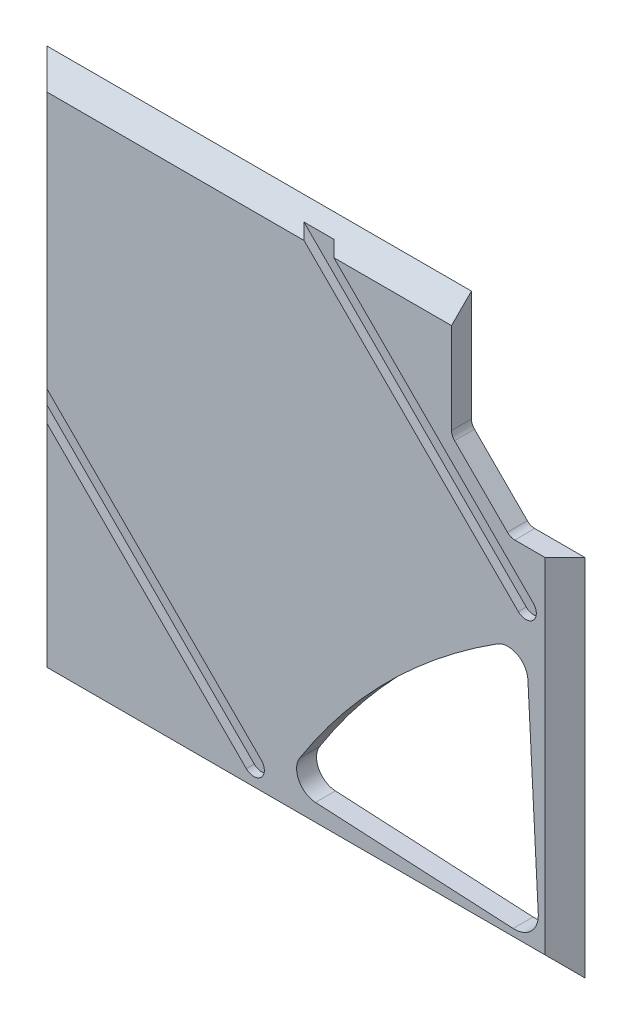
ISO-10303-21;
HEADER;
FILE_DESCRIPTION(('STEP AP214'),'2;1');
FILE_NAME('part.step','',(''),(''),'','','');
FILE_SCHEMA(('AUTOMOTIVE_DESIGN { 1 0 10303 214 1 1 1 1 }'));
ENDSEC;
DATA;
#1=APPLICATION_CONTEXT('core data for automotive mechanical design processes');
#2=APPLICATION_PROTOCOL_DEFINITION('international standard','automotive_design',2000,#1);
#3=PRODUCT_CONTEXT('',#1,'mechanical');
#4=PRODUCT('Part','Part','',(#3));
#5=PRODUCT_RELATED_PRODUCT_CATEGORY('part','',(#4));
#6=PRODUCT_DEFINITION_FORMATION('','',#4);
#7=PRODUCT_DEFINITION_CONTEXT('part definition',#1,'design');
#8=PRODUCT_DEFINITION('design','',#6,#7);
#9=PRODUCT_DEFINITION_SHAPE('','',#8);
#10=(LENGTH_UNIT() NAMED_UNIT(*) SI_UNIT(.MILLI.,.METRE.));
#11=(NAMED_UNIT(*) PLANE_ANGLE_UNIT() SI_UNIT($,.RADIAN.));
#12=(NAMED_UNIT(*) SI_UNIT($,.STERADIAN.) SOLID_ANGLE_UNIT());
#13=UNCERTAINTY_MEASURE_WITH_UNIT(LENGTH_MEASURE(1.E-05),#10,'distance_accuracy_value','');
#14=(GEOMETRIC_REPRESENTATION_CONTEXT(3) GLOBAL_UNCERTAINTY_ASSIGNED_CONTEXT((#13)) GLOBAL_UNIT_ASSIGNED_CONTEXT((#10,
#11,#12)) REPRESENTATION_CONTEXT('',''));
#15=CARTESIAN_POINT('',(0.,0.,0.));
#16=DIRECTION('',(0.,0.,1.));
#17=DIRECTION('',(1.,0.,0.));
#18=AXIS2_PLACEMENT_3D('',#15,#16,#17);
#19=CARTESIAN_POINT('',(-171.45,171.45,0.));
#20=DIRECTION('',(-0.707106781186546,0.,0.707106781186549));
#21=DIRECTION('',(0.707106781186549,0.,0.707106781186546));
#22=AXIS2_PLACEMENT_3D('',#19,#20,#21);
#23=PLANE('',#22);
#24=DIRECTION('',(0.,-1.,0.));
#25=VECTOR('',#24,1.);
#26=CARTESIAN_POINT('',(-163.83,171.45,7.62));
#27=LINE('',#26,#25);
#28=CARTESIAN_POINT('',(-163.83,-19.0080146249695,7.62));
#29=VERTEX_POINT('',#28);
#30=CARTESIAN_POINT('',(-163.83,0.0301283516971028,7.62));
#31=VERTEX_POINT('',#30);
#32=EDGE_CURVE('E11',#29,#31,#27,.F.);
#33=ORIENTED_EDGE('',*,*,#32,.T.);
#34=DIRECTION('',(-0.577350269189627,0.577350269189626,-0.577350269189624));
#35=VECTOR('',#34,1.);
#36=CARTESIAN_POINT('',(-226.049957216101,62.2500855677982,-54.5999572161009));
#37=LINE('',#36,#35);
#38=CARTESIAN_POINT('',(-158.75,-5.04987164830288,12.7));
#39=VERTEX_POINT('',#38);
#40=EDGE_CURVE('E335',#31,#39,#37,.F.);
#41=ORIENTED_EDGE('',*,*,#40,.T.);
#42=DIRECTION('',(0.,1.,0.));
#43=VECTOR('',#42,1.);
#44=CARTESIAN_POINT('',(-158.75,171.45,12.7));
#45=LINE('',#44,#43);
#46=CARTESIAN_POINT('',(-158.75,158.75,12.7));
#47=VERTEX_POINT('',#46);
#48=EDGE_CURVE('E360',#47,#39,#45,.F.);
#49=ORIENTED_EDGE('',*,*,#48,.F.);
#50=DIRECTION('',(-0.577350269189627,0.577350269189627,-0.577350269189624));
#51=VECTOR('',#50,1.);
#52=CARTESIAN_POINT('',(-171.45,171.45,0.));
#53=LINE('',#52,#51);
#54=CARTESIAN_POINT('',(-171.45,171.45,0.));
#55=VERTEX_POINT('',#54);
#56=EDGE_CURVE('E354',#47,#55,#53,.T.);
#57=ORIENTED_EDGE('',*,*,#56,.T.);
#58=DIRECTION('',(0.,-1.,0.));
#59=VECTOR('',#58,1.);
#60=CARTESIAN_POINT('',(-171.45,171.45,0.));
#61=LINE('',#60,#59);
#62=CARTESIAN_POINT('',(-171.45,-171.45,0.));
#63=VERTEX_POINT('',#62);
#64=EDGE_CURVE('E338',#55,#63,#61,.T.);
#65=ORIENTED_EDGE('',*,*,#64,.T.);
#66=DIRECTION('',(-0.577350269189626,-0.577350269189627,-0.577350269189624));
#67=VECTOR('',#66,1.);
#68=CARTESIAN_POINT('',(-171.45,-171.45,0.));
#69=LINE('',#68,#67);
#70=CARTESIAN_POINT('',(-158.75,-158.75,12.7));
#71=VERTEX_POINT('',#70);
#72=EDGE_CURVE('E349',#71,#63,#69,.T.);
#73=ORIENTED_EDGE('',*,*,#72,.F.);
#74=CARTESIAN_POINT('',(-158.75,-24.0880146249695,12.7));
#75=VERTEX_POINT('',#74);
#76=EDGE_CURVE('E348',#75,#71,#45,.F.);
#77=ORIENTED_EDGE('',*,*,#76,.F.);
#78=DIRECTION('',(0.577350269189627,-0.577350269189626,0.577350269189624));
#79=VECTOR('',#78,1.);
#80=CARTESIAN_POINT('',(-232.39600487499,49.5579902500205,-60.9460048749898));
#81=LINE('',#80,#79);
#82=EDGE_CURVE('E332',#75,#29,#81,.F.);
#83=ORIENTED_EDGE('',*,*,#82,.T.);
#84=EDGE_LOOP('',(#33,#41,#49,#57,#65,#73,#77,#83));
#85=FACE_BOUND('',#84,.T.);
#86=ADVANCED_FACE('F39',(#85),#23,.T.);
#87=CARTESIAN_POINT('',(-171.45,-171.45,0.));
#88=DIRECTION('',(0.,-0.707106781186546,0.707106781186549));
#89=DIRECTION('',(0.,-0.707106781186549,-0.707106781186546));
#90=AXIS2_PLACEMENT_3D('',#87,#88,#89);
#91=PLANE('',#90);
#92=DIRECTION('',(1.,0.,0.));
#93=VECTOR('',#92,1.);
#94=CARTESIAN_POINT('',(-171.45,-171.45,0.));
#95=LINE('',#94,#93);
#96=CARTESIAN_POINT('',(171.45,-171.45,0.));
#97=VERTEX_POINT('',#96);
#98=EDGE_CURVE('E341',#63,#97,#95,.T.);
#99=ORIENTED_EDGE('',*,*,#98,.T.);
#100=DIRECTION('',(0.577350269189627,-0.577350269189627,-0.577350269189624));
#101=VECTOR('',#100,1.);
#102=CARTESIAN_POINT('',(57.1499999999994,-57.1499999999997,114.3));
#103=LINE('',#102,#101);
#104=CARTESIAN_POINT('',(158.75,-158.75,12.7));
#105=VERTEX_POINT('',#104);
#106=EDGE_CURVE('E353',#105,#97,#103,.T.);
#107=ORIENTED_EDGE('',*,*,#106,.F.);
#108=DIRECTION('',(-1.,0.,0.));
#109=VECTOR('',#108,1.);
#110=CARTESIAN_POINT('',(-171.45,-158.75,12.7));
#111=LINE('',#110,#109);
#112=EDGE_CURVE('E363',#71,#105,#111,.F.);
#113=ORIENTED_EDGE('',*,*,#112,.F.);
#114=ORIENTED_EDGE('',*,*,#72,.T.);
#115=EDGE_LOOP('',(#99,#107,#113,#114));
#116=FACE_BOUND('',#115,.T.);
#117=ADVANCED_FACE('F426',(#116),#91,.T.);
#118=CARTESIAN_POINT('',(171.45,171.45,0.));
#119=DIRECTION('',(0.707106781186546,0.,0.707106781186549));
#120=DIRECTION('',(0.707106781186549,0.,-0.707106781186546));
#121=AXIS2_PLACEMENT_3D('',#118,#119,#120);
#122=PLANE('',#121);
#123=DIRECTION('',(0.,1.,0.));
#124=VECTOR('',#123,1.);
#125=CARTESIAN_POINT('',(171.45,171.45,0.));
#126=LINE('',#125,#124);
#127=CARTESIAN_POINT('',(171.45,60.579,0.));
#128=VERTEX_POINT('',#127);
#129=EDGE_CURVE('E343',#97,#128,#126,.T.);
#130=ORIENTED_EDGE('',*,*,#129,.T.);
#131=DIRECTION('',(0.707106781186549,0.,-0.707106781186546));
#132=VECTOR('',#131,1.);
#133=CARTESIAN_POINT('',(171.45,60.579,0.));
#134=LINE('',#133,#132);
#135=CARTESIAN_POINT('',(158.75,60.579,12.7));
#136=VERTEX_POINT('',#135);
#137=EDGE_CURVE('E286',#128,#136,#134,.F.);
#138=ORIENTED_EDGE('',*,*,#137,.T.);
#139=DIRECTION('',(0.,-1.,0.));
#140=VECTOR('',#139,1.);
#141=CARTESIAN_POINT('',(158.75,171.45,12.7));
#142=LINE('',#141,#140);
#143=EDGE_CURVE('E365',#105,#136,#142,.F.);
#144=ORIENTED_EDGE('',*,*,#143,.F.);
#145=ORIENTED_EDGE('',*,*,#106,.T.);
#146=EDGE_LOOP('',(#130,#138,#144,#145));
#147=FACE_BOUND('',#146,.T.);
#148=ADVANCED_FACE('F431',(#147),#122,.T.);
#149=CARTESIAN_POINT('',(-171.45,171.45,0.));
#150=DIRECTION('',(0.,0.707106781186546,0.707106781186549));
#151=DIRECTION('',(0.,-0.707106781186549,0.707106781186546));
#152=AXIS2_PLACEMENT_3D('',#149,#150,#151);
#153=PLANE('',#152);
#154=DIRECTION('',(1.,0.,0.));
#155=VECTOR('',#154,1.);
#156=CARTESIAN_POINT('',(-171.45,158.75,12.7));
#157=LINE('',#156,#155);
#158=CARTESIAN_POINT('',(99.0600000000005,158.75,12.7));
#159=VERTEX_POINT('',#158);
#160=CARTESIAN_POINT('',(24.0880146249694,158.75,12.7));
#161=VERTEX_POINT('',#160);
#162=EDGE_CURVE('E357',#159,#161,#157,.F.);
#163=ORIENTED_EDGE('',*,*,#162,.F.);
#164=DIRECTION('',(0.,-0.707106781186549,0.707106781186546));
#165=VECTOR('',#164,1.);
#166=CARTESIAN_POINT('',(99.0600000000005,171.45,0.));
#167=LINE('',#166,#165);
#168=CARTESIAN_POINT('',(99.0600000000005,171.45,0.));
#169=VERTEX_POINT('',#168);
#170=EDGE_CURVE('E277',#159,#169,#167,.F.);
#171=ORIENTED_EDGE('',*,*,#170,.T.);
#172=DIRECTION('',(-1.,0.,0.));
#173=VECTOR('',#172,1.);
#174=CARTESIAN_POINT('',(-171.45,171.45,0.));
#175=LINE('',#174,#173);
#176=EDGE_CURVE('E346',#169,#55,#175,.T.);
#177=ORIENTED_EDGE('',*,*,#176,.T.);
#178=ORIENTED_EDGE('',*,*,#56,.F.);
#179=CARTESIAN_POINT('',(5.04987164830285,158.75,12.7));
#180=VERTEX_POINT('',#179);
#181=EDGE_CURVE('E368',#180,#47,#157,.F.);
#182=ORIENTED_EDGE('',*,*,#181,.F.);
#183=DIRECTION('',(0.577350269189628,-0.577350269189626,0.577350269189624));
#184=VECTOR('',#183,1.);
#185=CARTESIAN_POINT('',(-62.2500855677983,226.049957216101,-54.5999572161008));
#186=LINE('',#185,#184);
#187=CARTESIAN_POINT('',(-0.0301283516971956,163.83,7.62));
#188=VERTEX_POINT('',#187);
#189=EDGE_CURVE('E329',#180,#188,#186,.F.);
#190=ORIENTED_EDGE('',*,*,#189,.T.);
#191=DIRECTION('',(1.,0.,0.));
#192=VECTOR('',#191,1.);
#193=CARTESIAN_POINT('',(-171.45,163.83,7.62));
#194=LINE('',#193,#192);
#195=CARTESIAN_POINT('',(19.0080146249695,163.83,7.62));
#196=VERTEX_POINT('',#195);
#197=EDGE_CURVE('E47',#196,#188,#194,.F.);
#198=ORIENTED_EDGE('',*,*,#197,.F.);
#199=DIRECTION('',(-0.577350269189628,0.577350269189626,-0.577350269189624));
#200=VECTOR('',#199,1.);
#201=CARTESIAN_POINT('',(-49.5579902500207,232.39600487499,-60.9460048749897));
#202=LINE('',#201,#200);
#203=EDGE_CURVE('E307',#196,#161,#202,.F.);
#204=ORIENTED_EDGE('',*,*,#203,.T.);
#205=EDGE_LOOP('',(#163,#171,#177,#178,#182,#190,#198,#204));
#206=FACE_BOUND('',#205,.T.);
#207=ADVANCED_FACE('F41',(#206),#153,.T.);
#208=CARTESIAN_POINT('',(0.,0.,12.7));
#209=DIRECTION('',(0.,0.,1.));
#210=DIRECTION('',(1.,0.,0.));
#211=AXIS2_PLACEMENT_3D('',#208,#209,#210);
#212=PLANE('',#211);
#213=CARTESIAN_POINT('',(345.666968748742,-345.666968748741,12.7));
#214=DIRECTION('',(0.,0.,-1.));
#215=DIRECTION('',(1.,0.,0.));
#216=AXIS2_PLACEMENT_3D('',#213,#214,#215);
#217=CIRCLE('',#216,406.4);
#218=CARTESIAN_POINT('',(2.3064887303102,-128.262873199664,12.7));
#219=VERTEX_POINT('',#218);
#220=CARTESIAN_POINT('',(128.262873199664,-2.30648873031014,12.7));
#221=VERTEX_POINT('',#220);
#222=EDGE_CURVE('E196',#219,#221,#217,.T.);
#223=ORIENTED_EDGE('',*,*,#222,.T.);
#224=CARTESIAN_POINT('',(135.056751185572,-13.0365037308861,12.7));
#225=DIRECTION('',(0.,0.,-1.));
#226=DIRECTION('',(1.,0.,0.));
#227=AXIS2_PLACEMENT_3D('',#224,#225,#226);
#228=CIRCLE('',#227,12.7);
#229=CARTESIAN_POINT('',(147.739346276955,-12.3718370866007,12.7));
#230=VERTEX_POINT('',#229);
#231=EDGE_CURVE('E205',#221,#230,#228,.T.);
#232=ORIENTED_EDGE('',*,*,#231,.T.);
#233=DIRECTION('',(0.0523359562429441,-0.998629534754574,0.));
#234=VECTOR('',#233,1.);
#235=CARTESIAN_POINT('',(154.34019207381,-138.323477991009,12.7));
#236=LINE('',#235,#234);
#237=CARTESIAN_POINT('',(154.34019207381,-138.323477991009,12.7));
#238=VERTEX_POINT('',#237);
#239=EDGE_CURVE('E54',#230,#238,#236,.T.);
#240=ORIENTED_EDGE('',*,*,#239,.T.);
#241=CARTESIAN_POINT('',(139.121077964151,-139.121077964151,12.7));
#242=DIRECTION('',(0.,0.,-1.));
#243=DIRECTION('',(-1.,0.,0.));
#244=AXIS2_PLACEMENT_3D('',#241,#242,#243);
#245=CIRCLE('',#244,15.24);
#246=CARTESIAN_POINT('',(138.323477991008,-154.340192073811,12.7));
#247=VERTEX_POINT('',#246);
#248=EDGE_CURVE('E220',#238,#247,#245,.T.);
#249=ORIENTED_EDGE('',*,*,#248,.T.);
#250=DIRECTION('',(-0.998629534754574,0.0523359562429438,0.));
#251=VECTOR('',#250,1.);
#252=CARTESIAN_POINT('',(12.3718370866009,-147.739346276956,12.7));
#253=LINE('',#252,#251);
#254=CARTESIAN_POINT('',(12.3718370866009,-147.739346276956,12.7));
#255=VERTEX_POINT('',#254);
#256=EDGE_CURVE('E223',#247,#255,#253,.T.);
#257=ORIENTED_EDGE('',*,*,#256,.T.);
#258=CARTESIAN_POINT('',(13.0365037308862,-135.056751185573,12.7));
#259=DIRECTION('',(0.,0.,-1.));
#260=DIRECTION('',(1.,0.,0.));
#261=AXIS2_PLACEMENT_3D('',#258,#259,#260);
#262=CIRCLE('',#261,12.7);
#263=EDGE_CURVE('E202',#255,#219,#262,.T.);
#264=ORIENTED_EDGE('',*,*,#263,.T.);
#265=EDGE_LOOP('',(#223,#232,#240,#249,#257,#264));
#266=FACE_BOUND('',#265,.T.);
#267=DIRECTION('',(1.,0.,0.));
#268=VECTOR('',#267,1.);
#269=CARTESIAN_POINT('',(139.362890784593,60.579,12.7));
#270=LINE('',#269,#268);
#271=CARTESIAN_POINT('',(139.362890784593,60.579,12.7));
#272=VERTEX_POINT('',#271);
#273=EDGE_CURVE('E251',#272,#136,#270,.T.);
#274=ORIENTED_EDGE('',*,*,#273,.F.);
#275=CARTESIAN_POINT('',(139.362890784593,67.183,12.7));
#276=DIRECTION('',(0.,0.,1.));
#277=DIRECTION('',(1.,0.,0.));
#278=AXIS2_PLACEMENT_3D('',#275,#276,#277);
#279=CIRCLE('',#278,6.60400000000001);
#280=CARTESIAN_POINT('',(134.693157601637,62.513266817044,12.7));
#281=VERTEX_POINT('',#280);
#282=EDGE_CURVE('E271',#281,#272,#279,.T.);
#283=ORIENTED_EDGE('',*,*,#282,.F.);
#284=DIRECTION('',(0.707106781186548,-0.707106781186548,0.));
#285=VECTOR('',#284,1.);
#286=CARTESIAN_POINT('',(100.994266817045,96.2121576016369,12.7));
#287=LINE('',#286,#285);
#288=CARTESIAN_POINT('',(100.994266817045,96.2121576016369,12.7));
#289=VERTEX_POINT('',#288);
#290=EDGE_CURVE('E268',#289,#281,#287,.T.);
#291=ORIENTED_EDGE('',*,*,#290,.F.);
#292=CARTESIAN_POINT('',(105.664,100.881890784593,12.7));
#293=DIRECTION('',(0.,0.,1.));
#294=DIRECTION('',(1.,0.,0.));
#295=AXIS2_PLACEMENT_3D('',#292,#293,#294);
#296=CIRCLE('',#295,6.60400000000001);
#297=CARTESIAN_POINT('',(99.0600000000005,100.881890784593,12.7));
#298=VERTEX_POINT('',#297);
#299=EDGE_CURVE('E265',#298,#289,#296,.T.);
#300=ORIENTED_EDGE('',*,*,#299,.F.);
#301=DIRECTION('',(0.,-1.,0.));
#302=VECTOR('',#301,1.);
#303=CARTESIAN_POINT('',(99.0600000000005,171.45,12.7));
#304=LINE('',#303,#302);
#305=EDGE_CURVE('E239',#159,#298,#304,.T.);
#306=ORIENTED_EDGE('',*,*,#305,.F.);
#307=ORIENTED_EDGE('',*,*,#162,.T.);
#308=DIRECTION('',(-0.707106781186549,0.707106781186546,0.));
#309=VECTOR('',#308,1.);
#310=CARTESIAN_POINT('',(151.13,31.7080146249701,12.7));
#311=LINE('',#310,#309);
#312=CARTESIAN_POINT('',(151.13,31.7080146249701,12.7));
#313=VERTEX_POINT('',#312);
#314=EDGE_CURVE('E316',#313,#161,#311,.T.);
#315=ORIENTED_EDGE('',*,*,#314,.F.);
#316=CARTESIAN_POINT('',(146.370464255833,26.9484788808035,12.7));
#317=DIRECTION('',(0.,0.,1.));
#318=DIRECTION('',(1.,0.,0.));
#319=AXIS2_PLACEMENT_3D('',#316,#317,#318);
#320=CIRCLE('',#319,6.73100000000002);
#321=CARTESIAN_POINT('',(141.610928511666,22.1889431366368,12.7));
#322=VERTEX_POINT('',#321);
#323=EDGE_CURVE('E303',#322,#313,#320,.T.);
#324=ORIENTED_EDGE('',*,*,#323,.F.);
#325=DIRECTION('',(0.707106781186549,-0.707106781186547,0.));
#326=VECTOR('',#325,1.);
#327=CARTESIAN_POINT('',(81.8999358241514,81.8999358241516,12.7));
#328=LINE('',#327,#326);
#329=EDGE_CURVE('E352',#180,#322,#328,.T.);
#330=ORIENTED_EDGE('',*,*,#329,.F.);
#331=ORIENTED_EDGE('',*,*,#181,.T.);
#332=ORIENTED_EDGE('',*,*,#48,.T.);
#333=DIRECTION('',(-0.707106781186548,0.707106781186547,0.));
#334=VECTOR('',#333,1.);
#335=CARTESIAN_POINT('',(-171.45,7.65012835169715,12.7));
#336=LINE('',#335,#334);
#337=CARTESIAN_POINT('',(-22.1889431366358,-141.610928511667,12.7));
#338=VERTEX_POINT('',#337);
#339=EDGE_CURVE('E293',#338,#39,#336,.T.);
#340=ORIENTED_EDGE('',*,*,#339,.F.);
#341=CARTESIAN_POINT('',(-26.9484788808025,-146.370464255833,12.7));
#342=DIRECTION('',(0.,0.,1.));
#343=DIRECTION('',(-1.,0.,0.));
#344=AXIS2_PLACEMENT_3D('',#341,#342,#343);
#345=CIRCLE('',#344,6.73100000000005);
#346=CARTESIAN_POINT('',(-31.7080146249692,-151.13,12.7));
#347=VERTEX_POINT('',#346);
#348=EDGE_CURVE('E300',#347,#338,#345,.T.);
#349=ORIENTED_EDGE('',*,*,#348,.F.);
#350=DIRECTION('',(0.707106781186548,-0.707106781186547,0.));
#351=VECTOR('',#350,1.);
#352=CARTESIAN_POINT('',(-91.4190073124846,-91.4190073124846,12.7));
#353=LINE('',#352,#351);
#354=EDGE_CURVE('E371',#75,#347,#353,.T.);
#355=ORIENTED_EDGE('',*,*,#354,.F.);
#356=ORIENTED_EDGE('',*,*,#76,.T.);
#357=ORIENTED_EDGE('',*,*,#112,.T.);
#358=ORIENTED_EDGE('',*,*,#143,.T.);
#359=EDGE_LOOP('',(#274,#283,#291,#300,#306,#307,#315,#324,#330,#331,#332,#340,#349,#355,#356,
#357,#358));
#360=FACE_BOUND('',#359,.T.);
#361=ADVANCED_FACE('F209',(#266,#360),#212,.T.);
#362=CARTESIAN_POINT('',(0.,0.,0.));
#363=DIRECTION('',(0.,0.,1.));
#364=DIRECTION('',(1.,0.,0.));
#365=AXIS2_PLACEMENT_3D('',#362,#363,#364);
#366=PLANE('',#365);
#367=CARTESIAN_POINT('',(135.056751185572,-13.0365037308861,0.));
#368=DIRECTION('',(0.,0.,-1.));
#369=DIRECTION('',(1.,0.,0.));
#370=AXIS2_PLACEMENT_3D('',#367,#368,#369);
#371=CIRCLE('',#370,12.7);
#372=CARTESIAN_POINT('',(128.262873199664,-2.30648873031014,0.));
#373=VERTEX_POINT('',#372);
#374=CARTESIAN_POINT('',(147.739346276955,-12.3718370866007,0.));
#375=VERTEX_POINT('',#374);
#376=EDGE_CURVE('E227',#373,#375,#371,.T.);
#377=ORIENTED_EDGE('',*,*,#376,.F.);
#378=CARTESIAN_POINT('',(345.666968748742,-345.666968748741,0.));
#379=DIRECTION('',(0.,0.,-1.));
#380=DIRECTION('',(1.,0.,0.));
#381=AXIS2_PLACEMENT_3D('',#378,#379,#380);
#382=CIRCLE('',#381,406.4);
#383=CARTESIAN_POINT('',(2.3064887303102,-128.262873199664,0.));
#384=VERTEX_POINT('',#383);
#385=EDGE_CURVE('E62',#384,#373,#382,.T.);
#386=ORIENTED_EDGE('',*,*,#385,.F.);
#387=CARTESIAN_POINT('',(13.0365037308862,-135.056751185573,0.));
#388=DIRECTION('',(0.,0.,-1.));
#389=DIRECTION('',(1.,0.,0.));
#390=AXIS2_PLACEMENT_3D('',#387,#388,#389);
#391=CIRCLE('',#390,12.7);
#392=CARTESIAN_POINT('',(12.3718370866009,-147.739346276956,0.));
#393=VERTEX_POINT('',#392);
#394=EDGE_CURVE('E213',#393,#384,#391,.T.);
#395=ORIENTED_EDGE('',*,*,#394,.F.);
#396=DIRECTION('',(-0.998629534754574,0.0523359562429438,0.));
#397=VECTOR('',#396,1.);
#398=CARTESIAN_POINT('',(12.3718370866009,-147.739346276956,0.));
#399=LINE('',#398,#397);
#400=CARTESIAN_POINT('',(138.323477991008,-154.340192073811,0.));
#401=VERTEX_POINT('',#400);
#402=EDGE_CURVE('E216',#401,#393,#399,.T.);
#403=ORIENTED_EDGE('',*,*,#402,.F.);
#404=CARTESIAN_POINT('',(139.121077964151,-139.121077964151,0.));
#405=DIRECTION('',(0.,0.,-1.));
#406=DIRECTION('',(-1.,0.,0.));
#407=AXIS2_PLACEMENT_3D('',#404,#405,#406);
#408=CIRCLE('',#407,15.24);
#409=CARTESIAN_POINT('',(154.34019207381,-138.323477991009,0.));
#410=VERTEX_POINT('',#409);
#411=EDGE_CURVE('E232',#410,#401,#408,.T.);
#412=ORIENTED_EDGE('',*,*,#411,.F.);
#413=DIRECTION('',(0.0523359562429441,-0.998629534754574,0.));
#414=VECTOR('',#413,1.);
#415=CARTESIAN_POINT('',(154.34019207381,-138.323477991009,0.));
#416=LINE('',#415,#414);
#417=EDGE_CURVE('E229',#375,#410,#416,.T.);
#418=ORIENTED_EDGE('',*,*,#417,.F.);
#419=EDGE_LOOP('',(#377,#386,#395,#403,#412,#418));
#420=FACE_BOUND('',#419,.T.);
#421=CARTESIAN_POINT('',(139.362890784593,67.183,0.));
#422=DIRECTION('',(0.,0.,1.));
#423=DIRECTION('',(1.,0.,0.));
#424=AXIS2_PLACEMENT_3D('',#421,#422,#423);
#425=CIRCLE('',#424,6.60400000000001);
#426=CARTESIAN_POINT('',(134.693157601637,62.513266817044,0.));
#427=VERTEX_POINT('',#426);
#428=CARTESIAN_POINT('',(139.362890784593,60.579,0.));
#429=VERTEX_POINT('',#428);
#430=EDGE_CURVE('E257',#427,#429,#425,.T.);
#431=ORIENTED_EDGE('',*,*,#430,.T.);
#432=DIRECTION('',(1.,0.,0.));
#433=VECTOR('',#432,1.);
#434=CARTESIAN_POINT('',(139.362890784593,60.579,0.));
#435=LINE('',#434,#433);
#436=EDGE_CURVE('E260',#429,#128,#435,.T.);
#437=ORIENTED_EDGE('',*,*,#436,.T.);
#438=ORIENTED_EDGE('',*,*,#129,.F.);
#439=ORIENTED_EDGE('',*,*,#98,.F.);
#440=ORIENTED_EDGE('',*,*,#64,.F.);
#441=ORIENTED_EDGE('',*,*,#176,.F.);
#442=DIRECTION('',(0.,-1.,0.));
#443=VECTOR('',#442,1.);
#444=CARTESIAN_POINT('',(99.0600000000005,171.45,0.));
#445=LINE('',#444,#443);
#446=CARTESIAN_POINT('',(99.0600000000005,100.881890784593,0.));
#447=VERTEX_POINT('',#446);
#448=EDGE_CURVE('E247',#169,#447,#445,.T.);
#449=ORIENTED_EDGE('',*,*,#448,.T.);
#450=CARTESIAN_POINT('',(105.664,100.881890784593,0.));
#451=DIRECTION('',(0.,0.,1.));
#452=DIRECTION('',(1.,0.,0.));
#453=AXIS2_PLACEMENT_3D('',#450,#451,#452);
#454=CIRCLE('',#453,6.60400000000001);
#455=CARTESIAN_POINT('',(100.994266817045,96.2121576016369,0.));
#456=VERTEX_POINT('',#455);
#457=EDGE_CURVE('E250',#447,#456,#454,.T.);
#458=ORIENTED_EDGE('',*,*,#457,.T.);
#459=DIRECTION('',(0.707106781186548,-0.707106781186548,0.));
#460=VECTOR('',#459,1.);
#461=CARTESIAN_POINT('',(100.994266817045,96.2121576016369,0.));
#462=LINE('',#461,#460);
#463=EDGE_CURVE('E254',#456,#427,#462,.T.);
#464=ORIENTED_EDGE('',*,*,#463,.T.);
#465=EDGE_LOOP('',(#431,#437,#438,#439,#440,#441,#449,#458,#464));
#466=FACE_BOUND('',#465,.T.);
#467=ADVANCED_FACE('F406',(#420,#466),#366,.F.);
#468=CARTESIAN_POINT('',(146.370464255833,26.9484788808035,7.62));
#469=DIRECTION('',(0.,0.,1.));
#470=DIRECTION('',(1.,0.,0.));
#471=AXIS2_PLACEMENT_3D('',#468,#469,#470);
#472=PLANE('',#471);
#473=ORIENTED_EDGE('',*,*,#197,.T.);
#474=DIRECTION('',(0.707106781186548,-0.707106781186546,0.));
#475=VECTOR('',#474,1.);
#476=CARTESIAN_POINT('',(-7.6501283516969,171.45,7.62));
#477=LINE('',#476,#475);
#478=CARTESIAN_POINT('',(141.610928511666,22.1889431366368,7.62));
#479=VERTEX_POINT('',#478);
#480=EDGE_CURVE('E313',#188,#479,#477,.T.);
#481=ORIENTED_EDGE('',*,*,#480,.T.);
#482=CARTESIAN_POINT('',(146.370464255833,26.9484788808035,7.62));
#483=DIRECTION('',(0.,0.,1.));
#484=DIRECTION('',(1.,0.,0.));
#485=AXIS2_PLACEMENT_3D('',#482,#483,#484);
#486=CIRCLE('',#485,6.73100000000002);
#487=CARTESIAN_POINT('',(151.13,31.7080146249701,7.62));
#488=VERTEX_POINT('',#487);
#489=EDGE_CURVE('E319',#479,#488,#486,.T.);
#490=ORIENTED_EDGE('',*,*,#489,.T.);
#491=DIRECTION('',(-0.707106781186549,0.707106781186546,0.));
#492=VECTOR('',#491,1.);
#493=CARTESIAN_POINT('',(151.13,31.7080146249701,7.62));
#494=LINE('',#493,#492);
#495=EDGE_CURVE('E322',#488,#196,#494,.T.);
#496=ORIENTED_EDGE('',*,*,#495,.T.);
#497=EDGE_LOOP('',(#473,#481,#490,#496));
#498=FACE_BOUND('',#497,.T.);
#499=ADVANCED_FACE('F375',(#498),#472,.T.);
#500=CARTESIAN_POINT('',(-7.6501283516969,171.45,7.62));
#501=DIRECTION('',(-0.707106781186547,-0.707106781186549,0.));
#502=DIRECTION('',(0.707106781186549,-0.707106781186547,0.));
#503=AXIS2_PLACEMENT_3D('',#500,#501,#502);
#504=PLANE('',#503);
#505=ORIENTED_EDGE('',*,*,#329,.T.);
#506=DIRECTION('',(0.,0.,1.));
#507=VECTOR('',#506,1.);
#508=CARTESIAN_POINT('',(141.610928511666,22.1889431366368,7.62));
#509=LINE('',#508,#507);
#510=EDGE_CURVE('E289',#479,#322,#509,.T.);
#511=ORIENTED_EDGE('',*,*,#510,.F.);
#512=ORIENTED_EDGE('',*,*,#480,.F.);
#513=ORIENTED_EDGE('',*,*,#189,.F.);
#514=EDGE_LOOP('',(#505,#511,#512,#513));
#515=FACE_BOUND('',#514,.T.);
#516=ADVANCED_FACE('F380',(#515),#504,.F.);
#517=CARTESIAN_POINT('',(151.13,31.7080146249701,7.62));
#518=DIRECTION('',(0.707106781186546,0.707106781186549,0.));
#519=DIRECTION('',(-0.707106781186549,0.707106781186546,0.));
#520=AXIS2_PLACEMENT_3D('',#517,#518,#519);
#521=PLANE('',#520);
#522=ORIENTED_EDGE('',*,*,#495,.F.);
#523=DIRECTION('',(0.,0.,1.));
#524=VECTOR('',#523,1.);
#525=CARTESIAN_POINT('',(151.13,31.7080146249701,7.62));
#526=LINE('',#525,#524);
#527=EDGE_CURVE('E310',#488,#313,#526,.T.);
#528=ORIENTED_EDGE('',*,*,#527,.T.);
#529=ORIENTED_EDGE('',*,*,#314,.T.);
#530=ORIENTED_EDGE('',*,*,#203,.F.);
#531=EDGE_LOOP('',(#522,#528,#529,#530));
#532=FACE_BOUND('',#531,.T.);
#533=ADVANCED_FACE('F394',(#532),#521,.F.);
#534=CARTESIAN_POINT('',(146.370464255833,26.9484788808035,7.62));
#535=DIRECTION('',(0.,0.,1.));
#536=DIRECTION('',(1.,0.,0.));
#537=AXIS2_PLACEMENT_3D('',#534,#535,#536);
#538=CYLINDRICAL_SURFACE('',#537,6.73100000000002);
#539=ORIENTED_EDGE('',*,*,#323,.T.);
#540=ORIENTED_EDGE('',*,*,#527,.F.);
#541=ORIENTED_EDGE('',*,*,#489,.F.);
#542=ORIENTED_EDGE('',*,*,#510,.T.);
#543=EDGE_LOOP('',(#539,#540,#541,#542));
#544=FACE_BOUND('',#543,.T.);
#545=ADVANCED_FACE('F392',(#544),#538,.F.);
#546=CARTESIAN_POINT('',(-26.9484788808025,-146.370464255833,7.62));
#547=DIRECTION('',(0.,0.,-1.));
#548=DIRECTION('',(-1.,0.,0.));
#549=AXIS2_PLACEMENT_3D('',#546,#547,#548);
#550=PLANE('',#549);
#551=DIRECTION('',(0.707106781186548,-0.707106781186547,0.));
#552=VECTOR('',#551,1.);
#553=CARTESIAN_POINT('',(-31.7080146249692,-151.13,7.62));
#554=LINE('',#553,#552);
#555=CARTESIAN_POINT('',(-31.7080146249692,-151.13,7.62));
#556=VERTEX_POINT('',#555);
#557=EDGE_CURVE('E290',#29,#556,#554,.T.);
#558=ORIENTED_EDGE('',*,*,#557,.T.);
#559=CARTESIAN_POINT('',(-26.9484788808025,-146.370464255833,7.62));
#560=DIRECTION('',(0.,0.,1.));
#561=DIRECTION('',(-1.,0.,0.));
#562=AXIS2_PLACEMENT_3D('',#559,#560,#561);
#563=CIRCLE('',#562,6.73100000000005);
#564=CARTESIAN_POINT('',(-22.1889431366358,-141.610928511667,7.62));
#565=VERTEX_POINT('',#564);
#566=EDGE_CURVE('E292',#556,#565,#563,.T.);
#567=ORIENTED_EDGE('',*,*,#566,.T.);
#568=DIRECTION('',(-0.707106781186548,0.707106781186547,0.));
#569=VECTOR('',#568,1.);
#570=CARTESIAN_POINT('',(-171.45,7.65012835169715,7.62));
#571=LINE('',#570,#569);
#572=EDGE_CURVE('E296',#565,#31,#571,.T.);
#573=ORIENTED_EDGE('',*,*,#572,.T.);
#574=ORIENTED_EDGE('',*,*,#32,.F.);
#575=EDGE_LOOP('',(#558,#567,#573,#574));
#576=FACE_BOUND('',#575,.T.);
#577=ADVANCED_FACE('F414',(#576),#550,.F.);
#578=CARTESIAN_POINT('',(-171.45,7.65012835169715,7.62));
#579=DIRECTION('',(0.707106781186547,0.707106781186548,0.));
#580=DIRECTION('',(-0.707106781186548,0.707106781186547,0.));
#581=AXIS2_PLACEMENT_3D('',#578,#579,#580);
#582=PLANE('',#581);
#583=ORIENTED_EDGE('',*,*,#572,.F.);
#584=DIRECTION('',(0.,0.,1.));
#585=VECTOR('',#584,1.);
#586=CARTESIAN_POINT('',(-22.1889431366358,-141.610928511667,7.62));
#587=LINE('',#586,#585);
#588=EDGE_CURVE('E305',#565,#338,#587,.T.);
#589=ORIENTED_EDGE('',*,*,#588,.T.);
#590=ORIENTED_EDGE('',*,*,#339,.T.);
#591=ORIENTED_EDGE('',*,*,#40,.F.);
#592=EDGE_LOOP('',(#583,#589,#590,#591));
#593=FACE_BOUND('',#592,.T.);
#594=ADVANCED_FACE('F412',(#593),#582,.F.);
#595=CARTESIAN_POINT('',(-31.7080146249692,-151.13,7.62));
#596=DIRECTION('',(-0.707106781186547,-0.707106781186548,0.));
#597=DIRECTION('',(0.707106781186548,-0.707106781186547,0.));
#598=AXIS2_PLACEMENT_3D('',#595,#596,#597);
#599=PLANE('',#598);
#600=ORIENTED_EDGE('',*,*,#354,.T.);
#601=DIRECTION('',(0.,0.,1.));
#602=VECTOR('',#601,1.);
#603=CARTESIAN_POINT('',(-31.7080146249692,-151.13,7.62));
#604=LINE('',#603,#602);
#605=EDGE_CURVE('E299',#556,#347,#604,.T.);
#606=ORIENTED_EDGE('',*,*,#605,.F.);
#607=ORIENTED_EDGE('',*,*,#557,.F.);
#608=ORIENTED_EDGE('',*,*,#82,.F.);
#609=EDGE_LOOP('',(#600,#606,#607,#608));
#610=FACE_BOUND('',#609,.T.);
#611=ADVANCED_FACE('F479',(#610),#599,.F.);
#612=CARTESIAN_POINT('',(-26.9484788808025,-146.370464255833,7.62));
#613=DIRECTION('',(0.,0.,1.));
#614=DIRECTION('',(1.,0.,0.));
#615=AXIS2_PLACEMENT_3D('',#612,#613,#614);
#616=CYLINDRICAL_SURFACE('',#615,6.73100000000005);
#617=ORIENTED_EDGE('',*,*,#348,.T.);
#618=ORIENTED_EDGE('',*,*,#588,.F.);
#619=ORIENTED_EDGE('',*,*,#566,.F.);
#620=ORIENTED_EDGE('',*,*,#605,.T.);
#621=EDGE_LOOP('',(#617,#618,#619,#620));
#622=FACE_BOUND('',#621,.T.);
#623=ADVANCED_FACE('F419',(#622),#616,.F.);
#624=CARTESIAN_POINT('',(139.362890784593,60.579,0.));
#625=DIRECTION('',(0.,-1.,0.));
#626=DIRECTION('',(1.,0.,0.));
#627=AXIS2_PLACEMENT_3D('',#624,#625,#626);
#628=PLANE('',#627);
#629=ORIENTED_EDGE('',*,*,#436,.F.);
#630=DIRECTION('',(0.,0.,1.));
#631=VECTOR('',#630,1.);
#632=CARTESIAN_POINT('',(139.362890784593,60.579,0.));
#633=LINE('',#632,#631);
#634=EDGE_CURVE('E275',#429,#272,#633,.T.);
#635=ORIENTED_EDGE('',*,*,#634,.T.);
#636=ORIENTED_EDGE('',*,*,#273,.T.);
#637=ORIENTED_EDGE('',*,*,#137,.F.);
#638=EDGE_LOOP('',(#629,#635,#636,#637));
#639=FACE_BOUND('',#638,.T.);
#640=ADVANCED_FACE('F435',(#639),#628,.F.);
#641=CARTESIAN_POINT('',(99.0600000000005,171.45,0.));
#642=DIRECTION('',(-1.,0.,0.));
#643=DIRECTION('',(0.,0.,1.));
#644=AXIS2_PLACEMENT_3D('',#641,#642,#643);
#645=PLANE('',#644);
#646=ORIENTED_EDGE('',*,*,#305,.T.);
#647=DIRECTION('',(0.,0.,1.));
#648=VECTOR('',#647,1.);
#649=CARTESIAN_POINT('',(99.0600000000005,100.881890784593,0.));
#650=LINE('',#649,#648);
#651=EDGE_CURVE('E263',#447,#298,#650,.T.);
#652=ORIENTED_EDGE('',*,*,#651,.F.);
#653=ORIENTED_EDGE('',*,*,#448,.F.);
#654=ORIENTED_EDGE('',*,*,#170,.F.);
#655=EDGE_LOOP('',(#646,#652,#653,#654));
#656=FACE_BOUND('',#655,.T.);
#657=ADVANCED_FACE('F401',(#656),#645,.F.);
#658=CARTESIAN_POINT('',(139.362890784593,67.183,0.));
#659=DIRECTION('',(0.,0.,1.));
#660=DIRECTION('',(1.,0.,0.));
#661=AXIS2_PLACEMENT_3D('',#658,#659,#660);
#662=CYLINDRICAL_SURFACE('',#661,6.60400000000001);
#663=ORIENTED_EDGE('',*,*,#282,.T.);
#664=ORIENTED_EDGE('',*,*,#634,.F.);
#665=ORIENTED_EDGE('',*,*,#430,.F.);
#666=DIRECTION('',(0.,0.,1.));
#667=VECTOR('',#666,1.);
#668=CARTESIAN_POINT('',(134.693157601637,62.513266817044,0.));
#669=LINE('',#668,#667);
#670=EDGE_CURVE('E278',#427,#281,#669,.T.);
#671=ORIENTED_EDGE('',*,*,#670,.T.);
#672=EDGE_LOOP('',(#663,#664,#665,#671));
#673=FACE_BOUND('',#672,.T.);
#674=ADVANCED_FACE('F438',(#673),#662,.F.);
#675=CARTESIAN_POINT('',(100.994266817045,96.2121576016369,0.));
#676=DIRECTION('',(-0.707106781186548,-0.707106781186548,0.));
#677=DIRECTION('',(0.707106781186548,-0.707106781186548,0.));
#678=AXIS2_PLACEMENT_3D('',#675,#676,#677);
#679=PLANE('',#678);
#680=ORIENTED_EDGE('',*,*,#290,.T.);
#681=ORIENTED_EDGE('',*,*,#670,.F.);
#682=ORIENTED_EDGE('',*,*,#463,.F.);
#683=DIRECTION('',(0.,0.,1.));
#684=VECTOR('',#683,1.);
#685=CARTESIAN_POINT('',(100.994266817045,96.2121576016369,0.));
#686=LINE('',#685,#684);
#687=EDGE_CURVE('E280',#456,#289,#686,.T.);
#688=ORIENTED_EDGE('',*,*,#687,.T.);
#689=EDGE_LOOP('',(#680,#681,#682,#688));
#690=FACE_BOUND('',#689,.T.);
#691=ADVANCED_FACE('F440',(#690),#679,.F.);
#692=CARTESIAN_POINT('',(105.664,100.881890784593,0.));
#693=DIRECTION('',(0.,0.,1.));
#694=DIRECTION('',(1.,0.,0.));
#695=AXIS2_PLACEMENT_3D('',#692,#693,#694);
#696=CYLINDRICAL_SURFACE('',#695,6.60400000000001);
#697=ORIENTED_EDGE('',*,*,#299,.T.);
#698=ORIENTED_EDGE('',*,*,#687,.F.);
#699=ORIENTED_EDGE('',*,*,#457,.F.);
#700=ORIENTED_EDGE('',*,*,#651,.T.);
#701=EDGE_LOOP('',(#697,#698,#699,#700));
#702=FACE_BOUND('',#701,.T.);
#703=ADVANCED_FACE('F403',(#702),#696,.F.);
#704=CARTESIAN_POINT('',(345.666968748742,-345.666968748741,12.7));
#705=DIRECTION('',(0.,0.,-1.));
#706=DIRECTION('',(-1.,0.,0.));
#707=AXIS2_PLACEMENT_3D('',#704,#705,#706);
#708=CYLINDRICAL_SURFACE('',#707,406.4);
#709=ORIENTED_EDGE('',*,*,#385,.T.);
#710=DIRECTION('',(0.,0.,-1.));
#711=VECTOR('',#710,1.);
#712=CARTESIAN_POINT('',(128.262873199664,-2.30648873031014,12.7));
#713=LINE('',#712,#711);
#714=EDGE_CURVE('E192',#221,#373,#713,.T.);
#715=ORIENTED_EDGE('',*,*,#714,.F.);
#716=ORIENTED_EDGE('',*,*,#222,.F.);
#717=DIRECTION('',(0.,0.,-1.));
#718=VECTOR('',#717,1.);
#719=CARTESIAN_POINT('',(2.3064887303102,-128.262873199664,12.7));
#720=LINE('',#719,#718);
#721=EDGE_CURVE('E237',#219,#384,#720,.T.);
#722=ORIENTED_EDGE('',*,*,#721,.T.);
#723=EDGE_LOOP('',(#709,#715,#716,#722));
#724=FACE_BOUND('',#723,.T.);
#725=ADVANCED_FACE('F194',(#724),#708,.F.);
#726=CARTESIAN_POINT('',(13.0365037308862,-135.056751185573,12.7));
#727=DIRECTION('',(0.,0.,-1.));
#728=DIRECTION('',(-1.,0.,0.));
#729=AXIS2_PLACEMENT_3D('',#726,#727,#728);
#730=CYLINDRICAL_SURFACE('',#729,12.7);
#731=ORIENTED_EDGE('',*,*,#394,.T.);
#732=ORIENTED_EDGE('',*,*,#721,.F.);
#733=ORIENTED_EDGE('',*,*,#263,.F.);
#734=DIRECTION('',(0.,0.,-1.));
#735=VECTOR('',#734,1.);
#736=CARTESIAN_POINT('',(12.3718370866009,-147.739346276956,12.7));
#737=LINE('',#736,#735);
#738=EDGE_CURVE('E240',#255,#393,#737,.T.);
#739=ORIENTED_EDGE('',*,*,#738,.T.);
#740=EDGE_LOOP('',(#731,#732,#733,#739));
#741=FACE_BOUND('',#740,.T.);
#742=ADVANCED_FACE('F496',(#741),#730,.F.);
#743=CARTESIAN_POINT('',(12.3718370866009,-147.739346276956,12.7));
#744=DIRECTION('',(-0.0523359562429438,-0.998629534754574,0.));
#745=DIRECTION('',(0.998629534754574,-0.0523359562429438,0.));
#746=AXIS2_PLACEMENT_3D('',#743,#744,#745);
#747=PLANE('',#746);
#748=ORIENTED_EDGE('',*,*,#402,.T.);
#749=ORIENTED_EDGE('',*,*,#738,.F.);
#750=ORIENTED_EDGE('',*,*,#256,.F.);
#751=DIRECTION('',(0.,0.,-1.));
#752=VECTOR('',#751,1.);
#753=CARTESIAN_POINT('',(138.323477991008,-154.340192073811,12.7));
#754=LINE('',#753,#752);
#755=EDGE_CURVE('E242',#247,#401,#754,.T.);
#756=ORIENTED_EDGE('',*,*,#755,.T.);
#757=EDGE_LOOP('',(#748,#749,#750,#756));
#758=FACE_BOUND('',#757,.T.);
#759=ADVANCED_FACE('F505',(#758),#747,.F.);
#760=CARTESIAN_POINT('',(139.121077964151,-139.121077964151,12.7));
#761=DIRECTION('',(0.,0.,-1.));
#762=DIRECTION('',(-1.,0.,0.));
#763=AXIS2_PLACEMENT_3D('',#760,#761,#762);
#764=CYLINDRICAL_SURFACE('',#763,15.24);
#765=ORIENTED_EDGE('',*,*,#411,.T.);
#766=ORIENTED_EDGE('',*,*,#755,.F.);
#767=ORIENTED_EDGE('',*,*,#248,.F.);
#768=DIRECTION('',(0.,0.,-1.));
#769=VECTOR('',#768,1.);
#770=CARTESIAN_POINT('',(154.34019207381,-138.323477991009,12.7));
#771=LINE('',#770,#769);
#772=EDGE_CURVE('E244',#238,#410,#771,.T.);
#773=ORIENTED_EDGE('',*,*,#772,.T.);
#774=EDGE_LOOP('',(#765,#766,#767,#773));
#775=FACE_BOUND('',#774,.T.);
#776=ADVANCED_FACE('F502',(#775),#764,.F.);
#777=CARTESIAN_POINT('',(154.34019207381,-138.323477991009,12.7));
#778=DIRECTION('',(0.998629534754574,0.0523359562429441,0.));
#779=DIRECTION('',(-0.0523359562429441,0.998629534754574,0.));
#780=AXIS2_PLACEMENT_3D('',#777,#778,#779);
#781=PLANE('',#780);
#782=ORIENTED_EDGE('',*,*,#417,.T.);
#783=ORIENTED_EDGE('',*,*,#772,.F.);
#784=ORIENTED_EDGE('',*,*,#239,.F.);
#785=DIRECTION('',(0.,0.,-1.));
#786=VECTOR('',#785,1.);
#787=CARTESIAN_POINT('',(147.739346276955,-12.3718370866007,12.7));
#788=LINE('',#787,#786);
#789=EDGE_CURVE('E201',#230,#375,#788,.T.);
#790=ORIENTED_EDGE('',*,*,#789,.T.);
#791=EDGE_LOOP('',(#782,#783,#784,#790));
#792=FACE_BOUND('',#791,.T.);
#793=ADVANCED_FACE('F499',(#792),#781,.F.);
#794=CARTESIAN_POINT('',(135.056751185572,-13.0365037308861,12.7));
#795=DIRECTION('',(0.,0.,-1.));
#796=DIRECTION('',(-1.,0.,0.));
#797=AXIS2_PLACEMENT_3D('',#794,#795,#796);
#798=CYLINDRICAL_SURFACE('',#797,12.7);
#799=ORIENTED_EDGE('',*,*,#376,.T.);
#800=ORIENTED_EDGE('',*,*,#789,.F.);
#801=ORIENTED_EDGE('',*,*,#231,.F.);
#802=ORIENTED_EDGE('',*,*,#714,.T.);
#803=EDGE_LOOP('',(#799,#800,#801,#802));
#804=FACE_BOUND('',#803,.T.);
#805=ADVANCED_FACE('F206',(#804),#798,.F.);
#806=CLOSED_SHELL('',(#86,#117,#148,#207,#361,#467,#499,#516,#533,#545,#577,#594,#611,#623,#640,
#657,#674,#691,#703,#725,#742,#759,#776,#793,#805));
#807=MANIFOLD_SOLID_BREP('B2',#806);
#808=ADVANCED_BREP_SHAPE_REPRESENTATION('',(#18,#807),#14);
#809=SHAPE_DEFINITION_REPRESENTATION(#9,#808);
ENDSEC;
END-ISO-10303-21;
